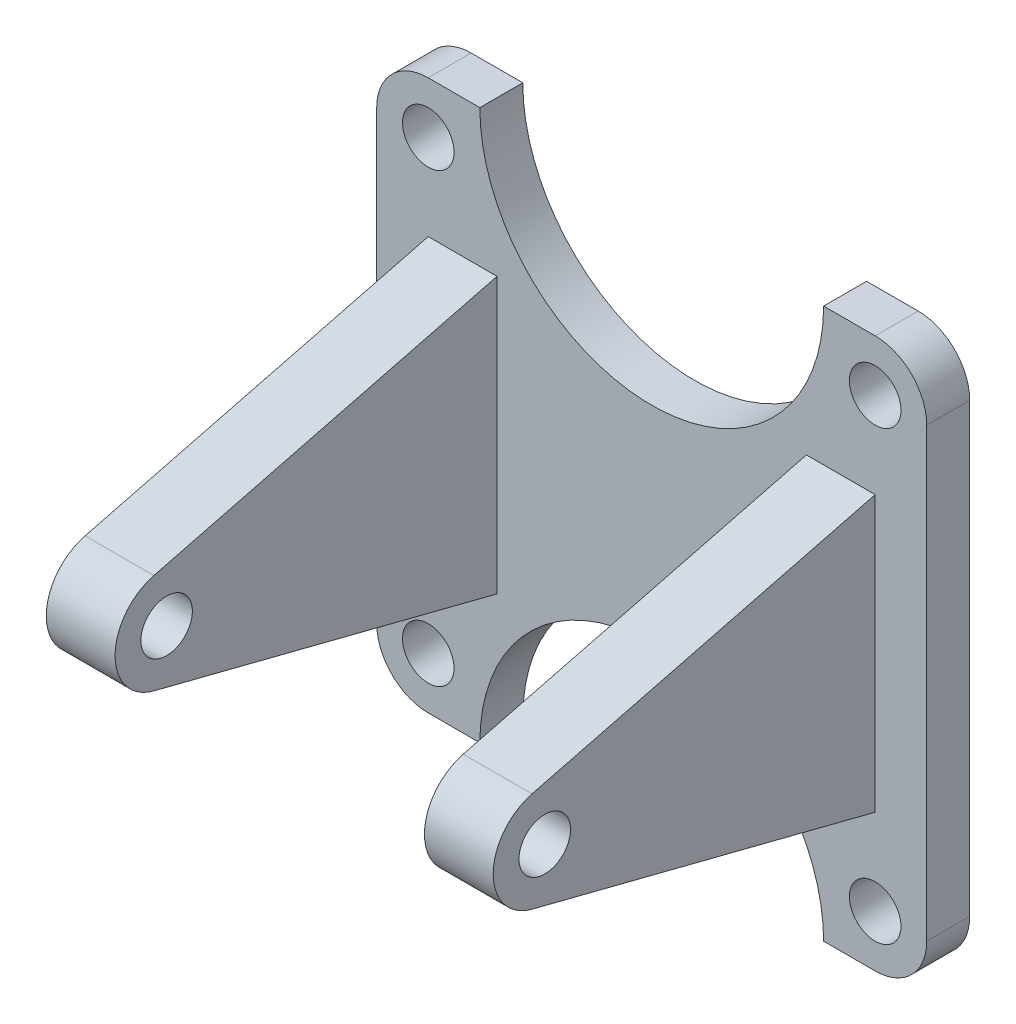
ISO-10303-21;
HEADER;
FILE_DESCRIPTION(('STEP AP214'),'2;1');
FILE_NAME('part.step','',(''),(''),'','','');
FILE_SCHEMA(('AUTOMOTIVE_DESIGN { 1 0 10303 214 1 1 1 1 }'));
ENDSEC;
DATA;
#1=APPLICATION_CONTEXT('core data for automotive mechanical design processes');
#2=APPLICATION_PROTOCOL_DEFINITION('international standard','automotive_design',2000,#1);
#3=PRODUCT_CONTEXT('',#1,'mechanical');
#4=PRODUCT('Part','Part','',(#3));
#5=PRODUCT_RELATED_PRODUCT_CATEGORY('part','',(#4));
#6=PRODUCT_DEFINITION_FORMATION('','',#4);
#7=PRODUCT_DEFINITION_CONTEXT('part definition',#1,'design');
#8=PRODUCT_DEFINITION('design','',#6,#7);
#9=PRODUCT_DEFINITION_SHAPE('','',#8);
#10=(LENGTH_UNIT() NAMED_UNIT(*) SI_UNIT(.MILLI.,.METRE.));
#11=(NAMED_UNIT(*) PLANE_ANGLE_UNIT() SI_UNIT($,.RADIAN.));
#12=(NAMED_UNIT(*) SI_UNIT($,.STERADIAN.) SOLID_ANGLE_UNIT());
#13=UNCERTAINTY_MEASURE_WITH_UNIT(LENGTH_MEASURE(1.E-05),#10,'distance_accuracy_value','');
#14=(GEOMETRIC_REPRESENTATION_CONTEXT(3) GLOBAL_UNCERTAINTY_ASSIGNED_CONTEXT((#13)) GLOBAL_UNIT_ASSIGNED_CONTEXT((#10,
#11,#12)) REPRESENTATION_CONTEXT('',''));
#15=CARTESIAN_POINT('',(0.,0.,0.));
#16=DIRECTION('',(0.,0.,1.));
#17=DIRECTION('',(1.,0.,0.));
#18=AXIS2_PLACEMENT_3D('',#15,#16,#17);
#19=CARTESIAN_POINT('',(-8.99999999999999,0.,25.));
#20=DIRECTION('',(1.,0.,0.));
#21=DIRECTION('',(0.,1.,0.));
#22=AXIS2_PLACEMENT_3D('',#19,#20,#21);
#23=PLANE('',#22);
#24=CARTESIAN_POINT('',(-8.99999999999999,0.,21.7224653082411));
#25=DIRECTION('',(1.,0.,0.));
#26=DIRECTION('',(0.,1.,0.));
#27=AXIS2_PLACEMENT_3D('',#24,#25,#26);
#28=CIRCLE('',#27,1.5);
#29=CARTESIAN_POINT('',(-8.99999999999999,1.5,21.7224653082411));
#30=VERTEX_POINT('',#29);
#31=EDGE_CURVE('E228',#30,#30,#28,.T.);
#32=ORIENTED_EDGE('',*,*,#31,.F.);
#33=EDGE_LOOP('',(#32));
#34=FACE_BOUND('',#33,.T.);
#35=DIRECTION('',(0.,0.247196350598422,0.968965409212745));
#36=VECTOR('',#35,1.);
#37=CARTESIAN_POINT('',(-8.99999999999999,-2.1218456712029,25.5413118997515));
#38=LINE('',#37,#36);
#39=CARTESIAN_POINT('',(-8.99999999999999,-8.,2.5));
#40=VERTEX_POINT('',#39);
#41=CARTESIAN_POINT('',(-9.,-2.90689622763824,22.4640543600364));
#42=VERTEX_POINT('',#41);
#43=EDGE_CURVE('E337',#40,#42,#38,.T.);
#44=ORIENTED_EDGE('',*,*,#43,.F.);
#45=DIRECTION('',(0.,-1.,0.));
#46=VECTOR('',#45,1.);
#47=CARTESIAN_POINT('',(-8.99999999999999,0.,2.5));
#48=LINE('',#47,#46);
#49=CARTESIAN_POINT('',(-9.,8.,2.5));
#50=VERTEX_POINT('',#49);
#51=EDGE_CURVE('E216',#50,#40,#48,.T.);
#52=ORIENTED_EDGE('',*,*,#51,.F.);
#53=DIRECTION('',(0.,0.247196350598421,-0.968965409212745));
#54=VECTOR('',#53,1.);
#55=CARTESIAN_POINT('',(-9.,2.1218456712029,25.5413118997515));
#56=LINE('',#55,#54);
#57=CARTESIAN_POINT('',(-9.,2.90689622763823,22.4640543600364));
#58=VERTEX_POINT('',#57);
#59=EDGE_CURVE('E81',#58,#50,#56,.T.);
#60=ORIENTED_EDGE('',*,*,#59,.F.);
#61=CARTESIAN_POINT('',(-8.99999999999999,0.,21.7224653082411));
#62=DIRECTION('',(1.,0.,0.));
#63=DIRECTION('',(0.,1.,0.));
#64=AXIS2_PLACEMENT_3D('',#61,#62,#63);
#65=CIRCLE('',#64,3.);
#66=EDGE_CURVE('E338',#58,#42,#65,.T.);
#67=ORIENTED_EDGE('',*,*,#66,.T.);
#68=EDGE_LOOP('',(#44,#52,#60,#67));
#69=FACE_BOUND('',#68,.T.);
#70=ADVANCED_FACE('F64',(#34,#69),#23,.T.);
#71=CARTESIAN_POINT('',(-13.,0.,25.));
#72=DIRECTION('',(1.,0.,0.));
#73=DIRECTION('',(0.,1.,0.));
#74=AXIS2_PLACEMENT_3D('',#71,#72,#73);
#75=PLANE('',#74);
#76=CARTESIAN_POINT('',(-13.,0.,21.7224653082411));
#77=DIRECTION('',(-1.,0.,0.));
#78=DIRECTION('',(0.,-1.,0.));
#79=AXIS2_PLACEMENT_3D('',#76,#77,#78);
#80=CIRCLE('',#79,1.5);
#81=CARTESIAN_POINT('',(-13.,-1.5,21.7224653082411));
#82=VERTEX_POINT('',#81);
#83=EDGE_CURVE('E454',#82,#82,#80,.T.);
#84=ORIENTED_EDGE('',*,*,#83,.F.);
#85=EDGE_LOOP('',(#84));
#86=FACE_BOUND('',#85,.T.);
#87=DIRECTION('',(0.,-1.,0.));
#88=VECTOR('',#87,1.);
#89=CARTESIAN_POINT('',(-13.,0.,2.5));
#90=LINE('',#89,#88);
#91=CARTESIAN_POINT('',(-13.,8.,2.5));
#92=VERTEX_POINT('',#91);
#93=CARTESIAN_POINT('',(-13.,-8.,2.5));
#94=VERTEX_POINT('',#93);
#95=EDGE_CURVE('E211',#92,#94,#90,.T.);
#96=ORIENTED_EDGE('',*,*,#95,.T.);
#97=DIRECTION('',(0.,-0.247196350598422,-0.968965409212745));
#98=VECTOR('',#97,1.);
#99=CARTESIAN_POINT('',(-13.,-8.10996349654032,2.06896279348092));
#100=LINE('',#99,#98);
#101=CARTESIAN_POINT('',(-13.,-2.90689622763824,22.4640543600364));
#102=VERTEX_POINT('',#101);
#103=EDGE_CURVE('E456',#102,#94,#100,.T.);
#104=ORIENTED_EDGE('',*,*,#103,.F.);
#105=CARTESIAN_POINT('',(-13.,0.,21.7224653082411));
#106=DIRECTION('',(-1.,0.,0.));
#107=DIRECTION('',(0.,-1.,0.));
#108=AXIS2_PLACEMENT_3D('',#105,#106,#107);
#109=CIRCLE('',#108,3.);
#110=CARTESIAN_POINT('',(-13.,2.90689622763823,22.4640543600364));
#111=VERTEX_POINT('',#110);
#112=EDGE_CURVE('E453',#102,#111,#109,.T.);
#113=ORIENTED_EDGE('',*,*,#112,.T.);
#114=DIRECTION('',(0.,-0.247196350598422,0.968965409212745));
#115=VECTOR('',#114,1.);
#116=CARTESIAN_POINT('',(-13.,8.10996349654032,2.06896279348092));
#117=LINE('',#116,#115);
#118=EDGE_CURVE('E447',#92,#111,#117,.T.);
#119=ORIENTED_EDGE('',*,*,#118,.F.);
#120=EDGE_LOOP('',(#96,#104,#113,#119));
#121=FACE_BOUND('',#120,.T.);
#122=ADVANCED_FACE('F424',(#86,#121),#75,.F.);
#123=CARTESIAN_POINT('',(0.,-16.,2.5));
#124=DIRECTION('',(0.,0.,-1.));
#125=DIRECTION('',(-1.,0.,0.));
#126=AXIS2_PLACEMENT_3D('',#123,#124,#125);
#127=CYLINDRICAL_SURFACE('',#126,10.);
#128=CARTESIAN_POINT('',(0.,-16.,0.));
#129=DIRECTION('',(0.,0.,1.));
#130=DIRECTION('',(1.,0.,0.));
#131=AXIS2_PLACEMENT_3D('',#128,#129,#130);
#132=CIRCLE('',#131,10.);
#133=CARTESIAN_POINT('',(-10.,-16.,0.));
#134=VERTEX_POINT('',#133);
#135=CARTESIAN_POINT('',(10.,-16.,0.));
#136=VERTEX_POINT('',#135);
#137=EDGE_CURVE('E227',#134,#136,#132,.F.);
#138=ORIENTED_EDGE('',*,*,#137,.T.);
#139=DIRECTION('',(0.,0.,-1.));
#140=VECTOR('',#139,1.);
#141=CARTESIAN_POINT('',(10.,-16.,2.5));
#142=LINE('',#141,#140);
#143=CARTESIAN_POINT('',(10.,-16.,2.5));
#144=VERTEX_POINT('',#143);
#145=EDGE_CURVE('E179',#144,#136,#142,.T.);
#146=ORIENTED_EDGE('',*,*,#145,.F.);
#147=CARTESIAN_POINT('',(0.,-16.,2.5));
#148=DIRECTION('',(0.,0.,1.));
#149=DIRECTION('',(1.,0.,0.));
#150=AXIS2_PLACEMENT_3D('',#147,#148,#149);
#151=CIRCLE('',#150,10.);
#152=CARTESIAN_POINT('',(-10.,-16.,2.5));
#153=VERTEX_POINT('',#152);
#154=EDGE_CURVE('E140',#153,#144,#151,.F.);
#155=ORIENTED_EDGE('',*,*,#154,.F.);
#156=DIRECTION('',(0.,0.,-1.));
#157=VECTOR('',#156,1.);
#158=CARTESIAN_POINT('',(-10.,-16.,2.5));
#159=LINE('',#158,#157);
#160=EDGE_CURVE('E132',#153,#134,#159,.T.);
#161=ORIENTED_EDGE('',*,*,#160,.T.);
#162=EDGE_LOOP('',(#138,#146,#155,#161));
#163=FACE_BOUND('',#162,.T.);
#164=ADVANCED_FACE('F178',(#163),#127,.F.);
#165=CARTESIAN_POINT('',(0.,-16.,2.5));
#166=DIRECTION('',(0.,-1.,0.));
#167=DIRECTION('',(1.,0.,0.));
#168=AXIS2_PLACEMENT_3D('',#165,#166,#167);
#169=PLANE('',#168);
#170=DIRECTION('',(-1.,0.,0.));
#171=VECTOR('',#170,1.);
#172=CARTESIAN_POINT('',(0.,-16.,0.));
#173=LINE('',#172,#171);
#174=CARTESIAN_POINT('',(13.,-16.,0.));
#175=VERTEX_POINT('',#174);
#176=EDGE_CURVE('E230',#175,#136,#173,.T.);
#177=ORIENTED_EDGE('',*,*,#176,.F.);
#178=DIRECTION('',(0.,0.,-1.));
#179=VECTOR('',#178,1.);
#180=CARTESIAN_POINT('',(13.,-16.,2.5));
#181=LINE('',#180,#179);
#182=CARTESIAN_POINT('',(13.,-16.,2.5));
#183=VERTEX_POINT('',#182);
#184=EDGE_CURVE('E287',#183,#175,#181,.T.);
#185=ORIENTED_EDGE('',*,*,#184,.F.);
#186=DIRECTION('',(-1.,0.,0.));
#187=VECTOR('',#186,1.);
#188=CARTESIAN_POINT('',(0.,-16.,2.5));
#189=LINE('',#188,#187);
#190=EDGE_CURVE('E181',#183,#144,#189,.T.);
#191=ORIENTED_EDGE('',*,*,#190,.T.);
#192=ORIENTED_EDGE('',*,*,#145,.T.);
#193=EDGE_LOOP('',(#177,#185,#191,#192));
#194=FACE_BOUND('',#193,.T.);
#195=ADVANCED_FACE('F385',(#194),#169,.T.);
#196=CARTESIAN_POINT('',(13.,-13.,2.5));
#197=DIRECTION('',(0.,0.,-1.));
#198=DIRECTION('',(-1.,0.,0.));
#199=AXIS2_PLACEMENT_3D('',#196,#197,#198);
#200=CYLINDRICAL_SURFACE('',#199,3.);
#201=CARTESIAN_POINT('',(13.,-13.,0.));
#202=DIRECTION('',(0.,0.,1.));
#203=DIRECTION('',(1.,0.,0.));
#204=AXIS2_PLACEMENT_3D('',#201,#202,#203);
#205=CIRCLE('',#204,3.);
#206=CARTESIAN_POINT('',(16.,-13.,0.));
#207=VERTEX_POINT('',#206);
#208=EDGE_CURVE('E233',#207,#175,#205,.F.);
#209=ORIENTED_EDGE('',*,*,#208,.F.);
#210=DIRECTION('',(0.,0.,-1.));
#211=VECTOR('',#210,1.);
#212=CARTESIAN_POINT('',(16.,-13.,2.5));
#213=LINE('',#212,#211);
#214=CARTESIAN_POINT('',(16.,-13.,2.5));
#215=VERTEX_POINT('',#214);
#216=EDGE_CURVE('E285',#215,#207,#213,.T.);
#217=ORIENTED_EDGE('',*,*,#216,.F.);
#218=CARTESIAN_POINT('',(13.,-13.,2.5));
#219=DIRECTION('',(0.,0.,1.));
#220=DIRECTION('',(1.,0.,0.));
#221=AXIS2_PLACEMENT_3D('',#218,#219,#220);
#222=CIRCLE('',#221,3.);
#223=EDGE_CURVE('E354',#215,#183,#222,.F.);
#224=ORIENTED_EDGE('',*,*,#223,.T.);
#225=ORIENTED_EDGE('',*,*,#184,.T.);
#226=EDGE_LOOP('',(#209,#217,#224,#225));
#227=FACE_BOUND('',#226,.T.);
#228=ADVANCED_FACE('F390',(#227),#200,.T.);
#229=CARTESIAN_POINT('',(16.,0.,2.5));
#230=DIRECTION('',(1.,0.,0.));
#231=DIRECTION('',(0.,1.,0.));
#232=AXIS2_PLACEMENT_3D('',#229,#230,#231);
#233=PLANE('',#232);
#234=DIRECTION('',(0.,-1.,0.));
#235=VECTOR('',#234,1.);
#236=CARTESIAN_POINT('',(16.,0.,0.));
#237=LINE('',#236,#235);
#238=CARTESIAN_POINT('',(16.,13.,0.));
#239=VERTEX_POINT('',#238);
#240=EDGE_CURVE('E236',#239,#207,#237,.T.);
#241=ORIENTED_EDGE('',*,*,#240,.F.);
#242=DIRECTION('',(0.,0.,-1.));
#243=VECTOR('',#242,1.);
#244=CARTESIAN_POINT('',(16.,13.,2.5));
#245=LINE('',#244,#243);
#246=CARTESIAN_POINT('',(16.,13.,2.5));
#247=VERTEX_POINT('',#246);
#248=EDGE_CURVE('E283',#247,#239,#245,.T.);
#249=ORIENTED_EDGE('',*,*,#248,.F.);
#250=DIRECTION('',(0.,-1.,0.));
#251=VECTOR('',#250,1.);
#252=CARTESIAN_POINT('',(16.,0.,2.5));
#253=LINE('',#252,#251);
#254=EDGE_CURVE('E357',#247,#215,#253,.T.);
#255=ORIENTED_EDGE('',*,*,#254,.T.);
#256=ORIENTED_EDGE('',*,*,#216,.T.);
#257=EDGE_LOOP('',(#241,#249,#255,#256));
#258=FACE_BOUND('',#257,.T.);
#259=ADVANCED_FACE('F393',(#258),#233,.T.);
#260=CARTESIAN_POINT('',(13.,13.,2.5));
#261=DIRECTION('',(0.,0.,-1.));
#262=DIRECTION('',(-1.,0.,0.));
#263=AXIS2_PLACEMENT_3D('',#260,#261,#262);
#264=CYLINDRICAL_SURFACE('',#263,3.);
#265=CARTESIAN_POINT('',(13.,13.,0.));
#266=DIRECTION('',(0.,0.,1.));
#267=DIRECTION('',(1.,0.,0.));
#268=AXIS2_PLACEMENT_3D('',#265,#266,#267);
#269=CIRCLE('',#268,3.);
#270=CARTESIAN_POINT('',(13.,16.,0.));
#271=VERTEX_POINT('',#270);
#272=EDGE_CURVE('E239',#271,#239,#269,.F.);
#273=ORIENTED_EDGE('',*,*,#272,.F.);
#274=DIRECTION('',(0.,0.,-1.));
#275=VECTOR('',#274,1.);
#276=CARTESIAN_POINT('',(13.,16.,2.5));
#277=LINE('',#276,#275);
#278=CARTESIAN_POINT('',(13.,16.,2.5));
#279=VERTEX_POINT('',#278);
#280=EDGE_CURVE('E281',#279,#271,#277,.T.);
#281=ORIENTED_EDGE('',*,*,#280,.F.);
#282=CARTESIAN_POINT('',(13.,13.,2.5));
#283=DIRECTION('',(0.,0.,1.));
#284=DIRECTION('',(1.,0.,0.));
#285=AXIS2_PLACEMENT_3D('',#282,#283,#284);
#286=CIRCLE('',#285,3.);
#287=EDGE_CURVE('E359',#279,#247,#286,.F.);
#288=ORIENTED_EDGE('',*,*,#287,.T.);
#289=ORIENTED_EDGE('',*,*,#248,.T.);
#290=EDGE_LOOP('',(#273,#281,#288,#289));
#291=FACE_BOUND('',#290,.T.);
#292=ADVANCED_FACE('F397',(#291),#264,.T.);
#293=CARTESIAN_POINT('',(0.,16.,2.5));
#294=DIRECTION('',(0.,-1.,0.));
#295=DIRECTION('',(1.,0.,0.));
#296=AXIS2_PLACEMENT_3D('',#293,#294,#295);
#297=PLANE('',#296);
#298=DIRECTION('',(-1.,0.,0.));
#299=VECTOR('',#298,1.);
#300=CARTESIAN_POINT('',(0.,16.,0.));
#301=LINE('',#300,#299);
#302=CARTESIAN_POINT('',(10.,16.,0.));
#303=VERTEX_POINT('',#302);
#304=EDGE_CURVE('E242',#271,#303,#301,.T.);
#305=ORIENTED_EDGE('',*,*,#304,.T.);
#306=DIRECTION('',(0.,0.,-1.));
#307=VECTOR('',#306,1.);
#308=CARTESIAN_POINT('',(10.,16.,2.5));
#309=LINE('',#308,#307);
#310=CARTESIAN_POINT('',(10.,16.,2.5));
#311=VERTEX_POINT('',#310);
#312=EDGE_CURVE('E279',#311,#303,#309,.T.);
#313=ORIENTED_EDGE('',*,*,#312,.F.);
#314=DIRECTION('',(-1.,0.,0.));
#315=VECTOR('',#314,1.);
#316=CARTESIAN_POINT('',(0.,16.,2.5));
#317=LINE('',#316,#315);
#318=EDGE_CURVE('E362',#279,#311,#317,.T.);
#319=ORIENTED_EDGE('',*,*,#318,.F.);
#320=ORIENTED_EDGE('',*,*,#280,.T.);
#321=EDGE_LOOP('',(#305,#313,#319,#320));
#322=FACE_BOUND('',#321,.T.);
#323=ADVANCED_FACE('F402',(#322),#297,.F.);
#324=CARTESIAN_POINT('',(0.,16.,2.5));
#325=DIRECTION('',(0.,0.,-1.));
#326=DIRECTION('',(-1.,0.,0.));
#327=AXIS2_PLACEMENT_3D('',#324,#325,#326);
#328=CYLINDRICAL_SURFACE('',#327,10.);
#329=CARTESIAN_POINT('',(0.,16.,0.));
#330=DIRECTION('',(0.,0.,1.));
#331=DIRECTION('',(1.,0.,0.));
#332=AXIS2_PLACEMENT_3D('',#329,#330,#331);
#333=CIRCLE('',#332,10.);
#334=CARTESIAN_POINT('',(-10.,16.,0.));
#335=VERTEX_POINT('',#334);
#336=EDGE_CURVE('E245',#335,#303,#333,.T.);
#337=ORIENTED_EDGE('',*,*,#336,.F.);
#338=DIRECTION('',(0.,0.,-1.));
#339=VECTOR('',#338,1.);
#340=CARTESIAN_POINT('',(-10.,16.,2.5));
#341=LINE('',#340,#339);
#342=CARTESIAN_POINT('',(-10.,16.,2.5));
#343=VERTEX_POINT('',#342);
#344=EDGE_CURVE('E277',#343,#335,#341,.T.);
#345=ORIENTED_EDGE('',*,*,#344,.F.);
#346=CARTESIAN_POINT('',(0.,16.,2.5));
#347=DIRECTION('',(0.,0.,1.));
#348=DIRECTION('',(1.,0.,0.));
#349=AXIS2_PLACEMENT_3D('',#346,#347,#348);
#350=CIRCLE('',#349,10.);
#351=EDGE_CURVE('E365',#343,#311,#350,.T.);
#352=ORIENTED_EDGE('',*,*,#351,.T.);
#353=ORIENTED_EDGE('',*,*,#312,.T.);
#354=EDGE_LOOP('',(#337,#345,#352,#353));
#355=FACE_BOUND('',#354,.T.);
#356=ADVANCED_FACE('F408',(#355),#328,.F.);
#357=CARTESIAN_POINT('',(0.,16.,2.5));
#358=DIRECTION('',(0.,-1.,0.));
#359=DIRECTION('',(1.,0.,0.));
#360=AXIS2_PLACEMENT_3D('',#357,#358,#359);
#361=PLANE('',#360);
#362=DIRECTION('',(-1.,0.,0.));
#363=VECTOR('',#362,1.);
#364=CARTESIAN_POINT('',(0.,16.,0.));
#365=LINE('',#364,#363);
#366=CARTESIAN_POINT('',(-13.,16.,0.));
#367=VERTEX_POINT('',#366);
#368=EDGE_CURVE('E248',#335,#367,#365,.T.);
#369=ORIENTED_EDGE('',*,*,#368,.T.);
#370=DIRECTION('',(0.,0.,-1.));
#371=VECTOR('',#370,1.);
#372=CARTESIAN_POINT('',(-13.,16.,2.5));
#373=LINE('',#372,#371);
#374=CARTESIAN_POINT('',(-13.,16.,2.5));
#375=VERTEX_POINT('',#374);
#376=EDGE_CURVE('E275',#375,#367,#373,.T.);
#377=ORIENTED_EDGE('',*,*,#376,.F.);
#378=DIRECTION('',(-1.,0.,0.));
#379=VECTOR('',#378,1.);
#380=CARTESIAN_POINT('',(0.,16.,2.5));
#381=LINE('',#380,#379);
#382=EDGE_CURVE('E367',#343,#375,#381,.T.);
#383=ORIENTED_EDGE('',*,*,#382,.F.);
#384=ORIENTED_EDGE('',*,*,#344,.T.);
#385=EDGE_LOOP('',(#369,#377,#383,#384));
#386=FACE_BOUND('',#385,.T.);
#387=ADVANCED_FACE('F411',(#386),#361,.F.);
#388=CARTESIAN_POINT('',(-13.,13.,2.5));
#389=DIRECTION('',(0.,0.,-1.));
#390=DIRECTION('',(-1.,0.,0.));
#391=AXIS2_PLACEMENT_3D('',#388,#389,#390);
#392=CYLINDRICAL_SURFACE('',#391,3.);
#393=CARTESIAN_POINT('',(-13.,13.,0.));
#394=DIRECTION('',(0.,0.,1.));
#395=DIRECTION('',(1.,0.,0.));
#396=AXIS2_PLACEMENT_3D('',#393,#394,#395);
#397=CIRCLE('',#396,3.);
#398=CARTESIAN_POINT('',(-16.,13.,0.));
#399=VERTEX_POINT('',#398);
#400=EDGE_CURVE('E251',#399,#367,#397,.F.);
#401=ORIENTED_EDGE('',*,*,#400,.F.);
#402=DIRECTION('',(0.,0.,-1.));
#403=VECTOR('',#402,1.);
#404=CARTESIAN_POINT('',(-16.,13.,2.5));
#405=LINE('',#404,#403);
#406=CARTESIAN_POINT('',(-16.,13.,2.5));
#407=VERTEX_POINT('',#406);
#408=EDGE_CURVE('E273',#407,#399,#405,.T.);
#409=ORIENTED_EDGE('',*,*,#408,.F.);
#410=CARTESIAN_POINT('',(-13.,13.,2.5));
#411=DIRECTION('',(0.,0.,1.));
#412=DIRECTION('',(1.,0.,0.));
#413=AXIS2_PLACEMENT_3D('',#410,#411,#412);
#414=CIRCLE('',#413,3.);
#415=EDGE_CURVE('E369',#407,#375,#414,.F.);
#416=ORIENTED_EDGE('',*,*,#415,.T.);
#417=ORIENTED_EDGE('',*,*,#376,.T.);
#418=EDGE_LOOP('',(#401,#409,#416,#417));
#419=FACE_BOUND('',#418,.T.);
#420=ADVANCED_FACE('F414',(#419),#392,.T.);
#421=CARTESIAN_POINT('',(-16.,0.,2.5));
#422=DIRECTION('',(1.,0.,0.));
#423=DIRECTION('',(0.,1.,0.));
#424=AXIS2_PLACEMENT_3D('',#421,#422,#423);
#425=PLANE('',#424);
#426=DIRECTION('',(0.,-1.,0.));
#427=VECTOR('',#426,1.);
#428=CARTESIAN_POINT('',(-16.,0.,0.));
#429=LINE('',#428,#427);
#430=CARTESIAN_POINT('',(-16.,-13.,0.));
#431=VERTEX_POINT('',#430);
#432=EDGE_CURVE('E254',#399,#431,#429,.T.);
#433=ORIENTED_EDGE('',*,*,#432,.T.);
#434=DIRECTION('',(0.,0.,-1.));
#435=VECTOR('',#434,1.);
#436=CARTESIAN_POINT('',(-16.,-13.,2.5));
#437=LINE('',#436,#435);
#438=CARTESIAN_POINT('',(-16.,-13.,2.5));
#439=VERTEX_POINT('',#438);
#440=EDGE_CURVE('E271',#439,#431,#437,.T.);
#441=ORIENTED_EDGE('',*,*,#440,.F.);
#442=DIRECTION('',(0.,-1.,0.));
#443=VECTOR('',#442,1.);
#444=CARTESIAN_POINT('',(-16.,0.,2.5));
#445=LINE('',#444,#443);
#446=EDGE_CURVE('E194',#407,#439,#445,.T.);
#447=ORIENTED_EDGE('',*,*,#446,.F.);
#448=ORIENTED_EDGE('',*,*,#408,.T.);
#449=EDGE_LOOP('',(#433,#441,#447,#448));
#450=FACE_BOUND('',#449,.T.);
#451=ADVANCED_FACE('F375',(#450),#425,.F.);
#452=CARTESIAN_POINT('',(-13.,-13.,2.5));
#453=DIRECTION('',(0.,0.,-1.));
#454=DIRECTION('',(-1.,0.,0.));
#455=AXIS2_PLACEMENT_3D('',#452,#453,#454);
#456=CYLINDRICAL_SURFACE('',#455,3.);
#457=CARTESIAN_POINT('',(-13.,-13.,0.));
#458=DIRECTION('',(0.,0.,1.));
#459=DIRECTION('',(1.,0.,0.));
#460=AXIS2_PLACEMENT_3D('',#457,#458,#459);
#461=CIRCLE('',#460,3.);
#462=CARTESIAN_POINT('',(-13.,-16.,0.));
#463=VERTEX_POINT('',#462);
#464=EDGE_CURVE('E257',#463,#431,#461,.F.);
#465=ORIENTED_EDGE('',*,*,#464,.F.);
#466=DIRECTION('',(0.,0.,-1.));
#467=VECTOR('',#466,1.);
#468=CARTESIAN_POINT('',(-13.,-16.,2.5));
#469=LINE('',#468,#467);
#470=CARTESIAN_POINT('',(-13.,-16.,2.5));
#471=VERTEX_POINT('',#470);
#472=EDGE_CURVE('E124',#471,#463,#469,.T.);
#473=ORIENTED_EDGE('',*,*,#472,.F.);
#474=CARTESIAN_POINT('',(-13.,-13.,2.5));
#475=DIRECTION('',(0.,0.,1.));
#476=DIRECTION('',(1.,0.,0.));
#477=AXIS2_PLACEMENT_3D('',#474,#475,#476);
#478=CIRCLE('',#477,3.);
#479=EDGE_CURVE('E188',#471,#439,#478,.F.);
#480=ORIENTED_EDGE('',*,*,#479,.T.);
#481=ORIENTED_EDGE('',*,*,#440,.T.);
#482=EDGE_LOOP('',(#465,#473,#480,#481));
#483=FACE_BOUND('',#482,.T.);
#484=ADVANCED_FACE('F378',(#483),#456,.T.);
#485=CARTESIAN_POINT('',(-13.,13.,2.5));
#486=DIRECTION('',(0.,0.,-1.));
#487=DIRECTION('',(-1.,0.,0.));
#488=AXIS2_PLACEMENT_3D('',#485,#486,#487);
#489=CYLINDRICAL_SURFACE('',#488,1.5);
#490=CARTESIAN_POINT('',(-13.,13.,2.5));
#491=DIRECTION('',(0.,0.,1.));
#492=DIRECTION('',(1.,0.,0.));
#493=AXIS2_PLACEMENT_3D('',#490,#491,#492);
#494=CIRCLE('',#493,1.5);
#495=CARTESIAN_POINT('',(-11.5,13.,2.5));
#496=VERTEX_POINT('',#495);
#497=EDGE_CURVE('E208',#496,#496,#494,.T.);
#498=ORIENTED_EDGE('',*,*,#497,.T.);
#499=EDGE_LOOP('',(#498));
#500=FACE_BOUND('',#499,.T.);
#501=CARTESIAN_POINT('',(-13.,13.,0.));
#502=DIRECTION('',(0.,0.,1.));
#503=DIRECTION('',(1.,0.,0.));
#504=AXIS2_PLACEMENT_3D('',#501,#502,#503);
#505=CIRCLE('',#504,1.5);
#506=CARTESIAN_POINT('',(-11.5,13.,0.));
#507=VERTEX_POINT('',#506);
#508=EDGE_CURVE('E264',#507,#507,#505,.T.);
#509=ORIENTED_EDGE('',*,*,#508,.F.);
#510=EDGE_LOOP('',(#509));
#511=FACE_BOUND('',#510,.T.);
#512=ADVANCED_FACE('F518',(#500,#511),#489,.F.);
#513=CARTESIAN_POINT('',(13.,-13.,2.5));
#514=DIRECTION('',(0.,0.,-1.));
#515=DIRECTION('',(-1.,0.,0.));
#516=AXIS2_PLACEMENT_3D('',#513,#514,#515);
#517=CYLINDRICAL_SURFACE('',#516,1.5);
#518=CARTESIAN_POINT('',(13.,-13.,2.5));
#519=DIRECTION('',(0.,0.,1.));
#520=DIRECTION('',(1.,0.,0.));
#521=AXIS2_PLACEMENT_3D('',#518,#519,#520);
#522=CIRCLE('',#521,1.5);
#523=CARTESIAN_POINT('',(14.5,-13.,2.5));
#524=VERTEX_POINT('',#523);
#525=EDGE_CURVE('E189',#524,#524,#522,.T.);
#526=ORIENTED_EDGE('',*,*,#525,.T.);
#527=EDGE_LOOP('',(#526));
#528=FACE_BOUND('',#527,.T.);
#529=CARTESIAN_POINT('',(13.,-13.,0.));
#530=DIRECTION('',(0.,0.,1.));
#531=DIRECTION('',(1.,0.,0.));
#532=AXIS2_PLACEMENT_3D('',#529,#530,#531);
#533=CIRCLE('',#532,1.5);
#534=CARTESIAN_POINT('',(14.5,-13.,0.));
#535=VERTEX_POINT('',#534);
#536=EDGE_CURVE('E261',#535,#535,#533,.T.);
#537=ORIENTED_EDGE('',*,*,#536,.F.);
#538=EDGE_LOOP('',(#537));
#539=FACE_BOUND('',#538,.T.);
#540=ADVANCED_FACE('F521',(#528,#539),#517,.F.);
#541=CARTESIAN_POINT('',(0.,-16.,2.5));
#542=DIRECTION('',(0.,-1.,0.));
#543=DIRECTION('',(1.,0.,0.));
#544=AXIS2_PLACEMENT_3D('',#541,#542,#543);
#545=PLANE('',#544);
#546=DIRECTION('',(-1.,0.,0.));
#547=VECTOR('',#546,1.);
#548=CARTESIAN_POINT('',(0.,-16.,0.));
#549=LINE('',#548,#547);
#550=EDGE_CURVE('E175',#134,#463,#549,.T.);
#551=ORIENTED_EDGE('',*,*,#550,.F.);
#552=ORIENTED_EDGE('',*,*,#160,.F.);
#553=DIRECTION('',(-1.,0.,0.));
#554=VECTOR('',#553,1.);
#555=CARTESIAN_POINT('',(0.,-16.,2.5));
#556=LINE('',#555,#554);
#557=EDGE_CURVE('E173',#153,#471,#556,.T.);
#558=ORIENTED_EDGE('',*,*,#557,.T.);
#559=ORIENTED_EDGE('',*,*,#472,.T.);
#560=EDGE_LOOP('',(#551,#552,#558,#559));
#561=FACE_BOUND('',#560,.T.);
#562=ADVANCED_FACE('F172',(#561),#545,.T.);
#563=CARTESIAN_POINT('',(-13.,-13.,2.5));
#564=DIRECTION('',(0.,0.,-1.));
#565=DIRECTION('',(-1.,0.,0.));
#566=AXIS2_PLACEMENT_3D('',#563,#564,#565);
#567=CYLINDRICAL_SURFACE('',#566,1.5);
#568=CARTESIAN_POINT('',(-13.,-13.,2.5));
#569=DIRECTION('',(0.,0.,1.));
#570=DIRECTION('',(1.,0.,0.));
#571=AXIS2_PLACEMENT_3D('',#568,#569,#570);
#572=CIRCLE('',#571,1.5);
#573=CARTESIAN_POINT('',(-11.5,-13.,2.5));
#574=VERTEX_POINT('',#573);
#575=EDGE_CURVE('E182',#574,#574,#572,.T.);
#576=ORIENTED_EDGE('',*,*,#575,.T.);
#577=EDGE_LOOP('',(#576));
#578=FACE_BOUND('',#577,.T.);
#579=CARTESIAN_POINT('',(-13.,-13.,0.));
#580=DIRECTION('',(0.,0.,1.));
#581=DIRECTION('',(1.,0.,0.));
#582=AXIS2_PLACEMENT_3D('',#579,#580,#581);
#583=CIRCLE('',#582,1.5);
#584=CARTESIAN_POINT('',(-11.5,-13.,0.));
#585=VERTEX_POINT('',#584);
#586=EDGE_CURVE('E224',#585,#585,#583,.T.);
#587=ORIENTED_EDGE('',*,*,#586,.F.);
#588=EDGE_LOOP('',(#587));
#589=FACE_BOUND('',#588,.T.);
#590=ADVANCED_FACE('F516',(#578,#589),#567,.F.);
#591=CARTESIAN_POINT('',(13.,13.,2.5));
#592=DIRECTION('',(0.,0.,-1.));
#593=DIRECTION('',(-1.,0.,0.));
#594=AXIS2_PLACEMENT_3D('',#591,#592,#593);
#595=CYLINDRICAL_SURFACE('',#594,1.5);
#596=CARTESIAN_POINT('',(13.,13.,2.5));
#597=DIRECTION('',(0.,0.,1.));
#598=DIRECTION('',(1.,0.,0.));
#599=AXIS2_PLACEMENT_3D('',#596,#597,#598);
#600=CIRCLE('',#599,1.5);
#601=CARTESIAN_POINT('',(14.5,13.,2.5));
#602=VERTEX_POINT('',#601);
#603=EDGE_CURVE('E176',#602,#602,#600,.T.);
#604=ORIENTED_EDGE('',*,*,#603,.T.);
#605=EDGE_LOOP('',(#604));
#606=FACE_BOUND('',#605,.T.);
#607=CARTESIAN_POINT('',(13.,13.,0.));
#608=DIRECTION('',(0.,0.,1.));
#609=DIRECTION('',(1.,0.,0.));
#610=AXIS2_PLACEMENT_3D('',#607,#608,#609);
#611=CIRCLE('',#610,1.5);
#612=CARTESIAN_POINT('',(14.5,13.,0.));
#613=VERTEX_POINT('',#612);
#614=EDGE_CURVE('E267',#613,#613,#611,.T.);
#615=ORIENTED_EDGE('',*,*,#614,.F.);
#616=EDGE_LOOP('',(#615));
#617=FACE_BOUND('',#616,.T.);
#618=ADVANCED_FACE('F513',(#606,#617),#595,.F.);
#619=CARTESIAN_POINT('',(0.,0.,2.5));
#620=DIRECTION('',(0.,0.,1.));
#621=DIRECTION('',(1.,0.,0.));
#622=AXIS2_PLACEMENT_3D('',#619,#620,#621);
#623=PLANE('',#622);
#624=DIRECTION('',(0.,-1.,0.));
#625=VECTOR('',#624,1.);
#626=CARTESIAN_POINT('',(13.,0.,2.5));
#627=LINE('',#626,#625);
#628=CARTESIAN_POINT('',(13.,8.,2.5));
#629=VERTEX_POINT('',#628);
#630=CARTESIAN_POINT('',(13.,-8.,2.5));
#631=VERTEX_POINT('',#630);
#632=EDGE_CURVE('E199',#629,#631,#627,.T.);
#633=ORIENTED_EDGE('',*,*,#632,.T.);
#634=DIRECTION('',(-1.,0.,0.));
#635=VECTOR('',#634,1.);
#636=CARTESIAN_POINT('',(0.,-7.99999999999999,2.5));
#637=LINE('',#636,#635);
#638=CARTESIAN_POINT('',(8.99999999999999,-8.,2.5));
#639=VERTEX_POINT('',#638);
#640=EDGE_CURVE('E202',#631,#639,#637,.T.);
#641=ORIENTED_EDGE('',*,*,#640,.T.);
#642=DIRECTION('',(0.,-1.,0.));
#643=VECTOR('',#642,1.);
#644=CARTESIAN_POINT('',(9.,0.,2.5));
#645=LINE('',#644,#643);
#646=CARTESIAN_POINT('',(9.,8.00000000000001,2.5));
#647=VERTEX_POINT('',#646);
#648=EDGE_CURVE('E205',#647,#639,#645,.T.);
#649=ORIENTED_EDGE('',*,*,#648,.F.);
#650=DIRECTION('',(-1.,0.,0.));
#651=VECTOR('',#650,1.);
#652=CARTESIAN_POINT('',(0.,8.00000000000001,2.5));
#653=LINE('',#652,#651);
#654=EDGE_CURVE('E192',#629,#647,#653,.T.);
#655=ORIENTED_EDGE('',*,*,#654,.F.);
#656=EDGE_LOOP('',(#633,#641,#649,#655));
#657=FACE_BOUND('',#656,.T.);
#658=ORIENTED_EDGE('',*,*,#51,.T.);
#659=DIRECTION('',(1.,0.,0.));
#660=VECTOR('',#659,1.);
#661=CARTESIAN_POINT('',(0.,-7.99999999999999,2.5));
#662=LINE('',#661,#660);
#663=EDGE_CURVE('E219',#94,#40,#662,.T.);
#664=ORIENTED_EDGE('',*,*,#663,.F.);
#665=ORIENTED_EDGE('',*,*,#95,.F.);
#666=DIRECTION('',(1.,0.,0.));
#667=VECTOR('',#666,1.);
#668=CARTESIAN_POINT('',(0.,8.00000000000001,2.5));
#669=LINE('',#668,#667);
#670=EDGE_CURVE('E214',#92,#50,#669,.T.);
#671=ORIENTED_EDGE('',*,*,#670,.T.);
#672=EDGE_LOOP('',(#658,#664,#665,#671));
#673=FACE_BOUND('',#672,.T.);
#674=ORIENTED_EDGE('',*,*,#154,.T.);
#675=ORIENTED_EDGE('',*,*,#190,.F.);
#676=ORIENTED_EDGE('',*,*,#223,.F.);
#677=ORIENTED_EDGE('',*,*,#254,.F.);
#678=ORIENTED_EDGE('',*,*,#287,.F.);
#679=ORIENTED_EDGE('',*,*,#318,.T.);
#680=ORIENTED_EDGE('',*,*,#351,.F.);
#681=ORIENTED_EDGE('',*,*,#382,.T.);
#682=ORIENTED_EDGE('',*,*,#415,.F.);
#683=ORIENTED_EDGE('',*,*,#446,.T.);
#684=ORIENTED_EDGE('',*,*,#479,.F.);
#685=ORIENTED_EDGE('',*,*,#557,.F.);
#686=EDGE_LOOP('',(#674,#675,#676,#677,#678,#679,#680,#681,#682,#683,#684,#685));
#687=FACE_BOUND('',#686,.T.);
#688=ORIENTED_EDGE('',*,*,#603,.F.);
#689=EDGE_LOOP('',(#688));
#690=FACE_BOUND('',#689,.T.);
#691=ORIENTED_EDGE('',*,*,#497,.F.);
#692=EDGE_LOOP('',(#691));
#693=FACE_BOUND('',#692,.T.);
#694=ORIENTED_EDGE('',*,*,#575,.F.);
#695=EDGE_LOOP('',(#694));
#696=FACE_BOUND('',#695,.T.);
#697=ORIENTED_EDGE('',*,*,#525,.F.);
#698=EDGE_LOOP('',(#697));
#699=FACE_BOUND('',#698,.T.);
#700=ADVANCED_FACE('F185',(#657,#673,#687,#690,#693,#696,#699),#623,.T.);
#701=CARTESIAN_POINT('',(0.,0.,0.));
#702=DIRECTION('',(0.,0.,1.));
#703=DIRECTION('',(1.,0.,0.));
#704=AXIS2_PLACEMENT_3D('',#701,#702,#703);
#705=PLANE('',#704);
#706=ORIENTED_EDGE('',*,*,#586,.T.);
#707=EDGE_LOOP('',(#706));
#708=FACE_BOUND('',#707,.T.);
#709=ORIENTED_EDGE('',*,*,#137,.F.);
#710=ORIENTED_EDGE('',*,*,#550,.T.);
#711=ORIENTED_EDGE('',*,*,#464,.T.);
#712=ORIENTED_EDGE('',*,*,#432,.F.);
#713=ORIENTED_EDGE('',*,*,#400,.T.);
#714=ORIENTED_EDGE('',*,*,#368,.F.);
#715=ORIENTED_EDGE('',*,*,#336,.T.);
#716=ORIENTED_EDGE('',*,*,#304,.F.);
#717=ORIENTED_EDGE('',*,*,#272,.T.);
#718=ORIENTED_EDGE('',*,*,#240,.T.);
#719=ORIENTED_EDGE('',*,*,#208,.T.);
#720=ORIENTED_EDGE('',*,*,#176,.T.);
#721=EDGE_LOOP('',(#709,#710,#711,#712,#713,#714,#715,#716,#717,#718,#719,#720));
#722=FACE_BOUND('',#721,.T.);
#723=ORIENTED_EDGE('',*,*,#536,.T.);
#724=EDGE_LOOP('',(#723));
#725=FACE_BOUND('',#724,.T.);
#726=ORIENTED_EDGE('',*,*,#508,.T.);
#727=EDGE_LOOP('',(#726));
#728=FACE_BOUND('',#727,.T.);
#729=ORIENTED_EDGE('',*,*,#614,.T.);
#730=EDGE_LOOP('',(#729));
#731=FACE_BOUND('',#730,.T.);
#732=ADVANCED_FACE('F380',(#708,#722,#725,#728,#731),#705,.F.);
#733=CARTESIAN_POINT('',(13.,0.,25.));
#734=DIRECTION('',(1.,0.,0.));
#735=DIRECTION('',(0.,1.,0.));
#736=AXIS2_PLACEMENT_3D('',#733,#734,#735);
#737=PLANE('',#736);
#738=CARTESIAN_POINT('',(13.,0.,21.7224653082411));
#739=DIRECTION('',(1.,0.,0.));
#740=DIRECTION('',(0.,1.,0.));
#741=AXIS2_PLACEMENT_3D('',#738,#739,#740);
#742=CIRCLE('',#741,1.5);
#743=CARTESIAN_POINT('',(13.,1.5,21.7224653082411));
#744=VERTEX_POINT('',#743);
#745=EDGE_CURVE('E346',#744,#744,#742,.T.);
#746=ORIENTED_EDGE('',*,*,#745,.F.);
#747=EDGE_LOOP('',(#746));
#748=FACE_BOUND('',#747,.T.);
#749=DIRECTION('',(0.,0.247196350598422,0.968965409212745));
#750=VECTOR('',#749,1.);
#751=CARTESIAN_POINT('',(13.,-2.1218456712029,25.5413118997515));
#752=LINE('',#751,#750);
#753=CARTESIAN_POINT('',(13.,-2.90689622763823,22.4640543600364));
#754=VERTEX_POINT('',#753);
#755=EDGE_CURVE('E316',#631,#754,#752,.T.);
#756=ORIENTED_EDGE('',*,*,#755,.F.);
#757=ORIENTED_EDGE('',*,*,#632,.F.);
#758=DIRECTION('',(0.,0.247196350598421,-0.968965409212745));
#759=VECTOR('',#758,1.);
#760=CARTESIAN_POINT('',(13.,2.1218456712029,25.5413118997515));
#761=LINE('',#760,#759);
#762=CARTESIAN_POINT('',(13.,2.90689622763823,22.4640543600364));
#763=VERTEX_POINT('',#762);
#764=EDGE_CURVE('E317',#763,#629,#761,.T.);
#765=ORIENTED_EDGE('',*,*,#764,.F.);
#766=CARTESIAN_POINT('',(13.,0.,21.7224653082411));
#767=DIRECTION('',(1.,0.,0.));
#768=DIRECTION('',(0.,1.,0.));
#769=AXIS2_PLACEMENT_3D('',#766,#767,#768);
#770=CIRCLE('',#769,3.);
#771=EDGE_CURVE('E336',#763,#754,#770,.T.);
#772=ORIENTED_EDGE('',*,*,#771,.T.);
#773=EDGE_LOOP('',(#756,#757,#765,#772));
#774=FACE_BOUND('',#773,.T.);
#775=ADVANCED_FACE('F334',(#748,#774),#737,.T.);
#776=CARTESIAN_POINT('',(9.,0.,25.));
#777=DIRECTION('',(1.,0.,0.));
#778=DIRECTION('',(0.,1.,0.));
#779=AXIS2_PLACEMENT_3D('',#776,#777,#778);
#780=PLANE('',#779);
#781=CARTESIAN_POINT('',(9.,0.,21.7224653082411));
#782=DIRECTION('',(1.,0.,0.));
#783=DIRECTION('',(0.,1.,0.));
#784=AXIS2_PLACEMENT_3D('',#781,#782,#783);
#785=CIRCLE('',#784,1.5);
#786=CARTESIAN_POINT('',(9.,1.5,21.7224653082411));
#787=VERTEX_POINT('',#786);
#788=EDGE_CURVE('E67',#787,#787,#785,.T.);
#789=ORIENTED_EDGE('',*,*,#788,.T.);
#790=EDGE_LOOP('',(#789));
#791=FACE_BOUND('',#790,.T.);
#792=ORIENTED_EDGE('',*,*,#648,.T.);
#793=DIRECTION('',(0.,0.247196350598422,0.968965409212745));
#794=VECTOR('',#793,1.);
#795=CARTESIAN_POINT('',(9.,-2.1218456712029,25.5413118997515));
#796=LINE('',#795,#794);
#797=CARTESIAN_POINT('',(9.,-2.90689622763823,22.4640543600364));
#798=VERTEX_POINT('',#797);
#799=EDGE_CURVE('E12',#639,#798,#796,.T.);
#800=ORIENTED_EDGE('',*,*,#799,.T.);
#801=CARTESIAN_POINT('',(9.,0.,21.7224653082411));
#802=DIRECTION('',(1.,0.,0.));
#803=DIRECTION('',(0.,1.,0.));
#804=AXIS2_PLACEMENT_3D('',#801,#802,#803);
#805=CIRCLE('',#804,3.);
#806=CARTESIAN_POINT('',(9.,2.90689622763823,22.4640543600364));
#807=VERTEX_POINT('',#806);
#808=EDGE_CURVE('E73',#807,#798,#805,.T.);
#809=ORIENTED_EDGE('',*,*,#808,.F.);
#810=DIRECTION('',(0.,0.247196350598421,-0.968965409212745));
#811=VECTOR('',#810,1.);
#812=CARTESIAN_POINT('',(9.,2.1218456712029,25.5413118997515));
#813=LINE('',#812,#811);
#814=EDGE_CURVE('E290',#807,#647,#813,.T.);
#815=ORIENTED_EDGE('',*,*,#814,.T.);
#816=EDGE_LOOP('',(#792,#800,#809,#815));
#817=FACE_BOUND('',#816,.T.);
#818=ADVANCED_FACE('F320',(#791,#817),#780,.F.);
#819=CARTESIAN_POINT('',(16.,8.10996349654032,2.06896279348092));
#820=DIRECTION('',(0.,-0.968965409212745,-0.247196350598422));
#821=DIRECTION('',(0.,0.247196350598421,-0.968965409212745));
#822=AXIS2_PLACEMENT_3D('',#819,#820,#821);
#823=PLANE('',#822);
#824=ORIENTED_EDGE('',*,*,#764,.T.);
#825=ORIENTED_EDGE('',*,*,#654,.T.);
#826=ORIENTED_EDGE('',*,*,#814,.F.);
#827=DIRECTION('',(-1.,0.,0.));
#828=VECTOR('',#827,1.);
#829=CARTESIAN_POINT('',(16.,2.90689622763824,22.4640543600364));
#830=LINE('',#829,#828);
#831=EDGE_CURVE('E307',#763,#807,#830,.T.);
#832=ORIENTED_EDGE('',*,*,#831,.F.);
#833=EDGE_LOOP('',(#824,#825,#826,#832));
#834=FACE_BOUND('',#833,.T.);
#835=ADVANCED_FACE('F469',(#834),#823,.F.);
#836=CARTESIAN_POINT('',(16.,0.,21.7224653082411));
#837=DIRECTION('',(-1.,0.,0.));
#838=DIRECTION('',(0.,-1.,0.));
#839=AXIS2_PLACEMENT_3D('',#836,#837,#838);
#840=CYLINDRICAL_SURFACE('',#839,3.);
#841=ORIENTED_EDGE('',*,*,#831,.T.);
#842=ORIENTED_EDGE('',*,*,#808,.T.);
#843=DIRECTION('',(-1.,0.,0.));
#844=VECTOR('',#843,1.);
#845=CARTESIAN_POINT('',(16.,-2.90689622763823,22.4640543600364));
#846=LINE('',#845,#844);
#847=EDGE_CURVE('E303',#754,#798,#846,.T.);
#848=ORIENTED_EDGE('',*,*,#847,.F.);
#849=ORIENTED_EDGE('',*,*,#771,.F.);
#850=EDGE_LOOP('',(#841,#842,#848,#849));
#851=FACE_BOUND('',#850,.T.);
#852=ADVANCED_FACE('F300',(#851),#840,.T.);
#853=CARTESIAN_POINT('',(16.,-8.10996349654032,2.06896279348092));
#854=DIRECTION('',(0.,0.968965409212745,-0.247196350598422));
#855=DIRECTION('',(0.,0.247196350598422,0.968965409212745));
#856=AXIS2_PLACEMENT_3D('',#853,#854,#855);
#857=PLANE('',#856);
#858=ORIENTED_EDGE('',*,*,#755,.T.);
#859=ORIENTED_EDGE('',*,*,#847,.T.);
#860=ORIENTED_EDGE('',*,*,#799,.F.);
#861=ORIENTED_EDGE('',*,*,#640,.F.);
#862=EDGE_LOOP('',(#858,#859,#860,#861));
#863=FACE_BOUND('',#862,.T.);
#864=ADVANCED_FACE('F312',(#863),#857,.F.);
#865=CARTESIAN_POINT('',(16.,0.,21.7224653082411));
#866=DIRECTION('',(-1.,0.,0.));
#867=DIRECTION('',(0.,-1.,0.));
#868=AXIS2_PLACEMENT_3D('',#865,#866,#867);
#869=CYLINDRICAL_SURFACE('',#868,1.5);
#870=ORIENTED_EDGE('',*,*,#745,.T.);
#871=EDGE_LOOP('',(#870));
#872=FACE_BOUND('',#871,.T.);
#873=ORIENTED_EDGE('',*,*,#788,.F.);
#874=EDGE_LOOP('',(#873));
#875=FACE_BOUND('',#874,.T.);
#876=ADVANCED_FACE('F485',(#872,#875),#869,.F.);
#877=ORIENTED_EDGE('',*,*,#43,.T.);
#878=EDGE_CURVE('E318',#42,#102,#846,.T.);
#879=ORIENTED_EDGE('',*,*,#878,.T.);
#880=ORIENTED_EDGE('',*,*,#103,.T.);
#881=ORIENTED_EDGE('',*,*,#663,.T.);
#882=EDGE_LOOP('',(#877,#879,#880,#881));
#883=FACE_BOUND('',#882,.T.);
#884=ADVANCED_FACE('F480',(#883),#857,.F.);
#885=EDGE_CURVE('E462',#58,#111,#830,.T.);
#886=ORIENTED_EDGE('',*,*,#885,.T.);
#887=ORIENTED_EDGE('',*,*,#112,.F.);
#888=ORIENTED_EDGE('',*,*,#878,.F.);
#889=ORIENTED_EDGE('',*,*,#66,.F.);
#890=EDGE_LOOP('',(#886,#887,#888,#889));
#891=FACE_BOUND('',#890,.T.);
#892=ADVANCED_FACE('F478',(#891),#840,.T.);
#893=ORIENTED_EDGE('',*,*,#59,.T.);
#894=ORIENTED_EDGE('',*,*,#670,.F.);
#895=ORIENTED_EDGE('',*,*,#118,.T.);
#896=ORIENTED_EDGE('',*,*,#885,.F.);
#897=EDGE_LOOP('',(#893,#894,#895,#896));
#898=FACE_BOUND('',#897,.T.);
#899=ADVANCED_FACE('F445',(#898),#823,.F.);
#900=ORIENTED_EDGE('',*,*,#31,.T.);
#901=EDGE_LOOP('',(#900));
#902=FACE_BOUND('',#901,.T.);
#903=ORIENTED_EDGE('',*,*,#83,.T.);
#904=EDGE_LOOP('',(#903));
#905=FACE_BOUND('',#904,.T.);
#906=ADVANCED_FACE('F494',(#902,#905),#869,.F.);
#907=CLOSED_SHELL('',(#70,#122,#164,#195,#228,#259,#292,#323,#356,#387,#420,#451,#484,#512,#540,
#562,#590,#618,#700,#732,#775,#818,#835,#852,#864,#876,#884,#892,#899,#906));
#908=MANIFOLD_SOLID_BREP('B2',#907);
#909=ADVANCED_BREP_SHAPE_REPRESENTATION('',(#18,#908),#14);
#910=SHAPE_DEFINITION_REPRESENTATION(#9,#909);
ENDSEC;
END-ISO-10303-21;
